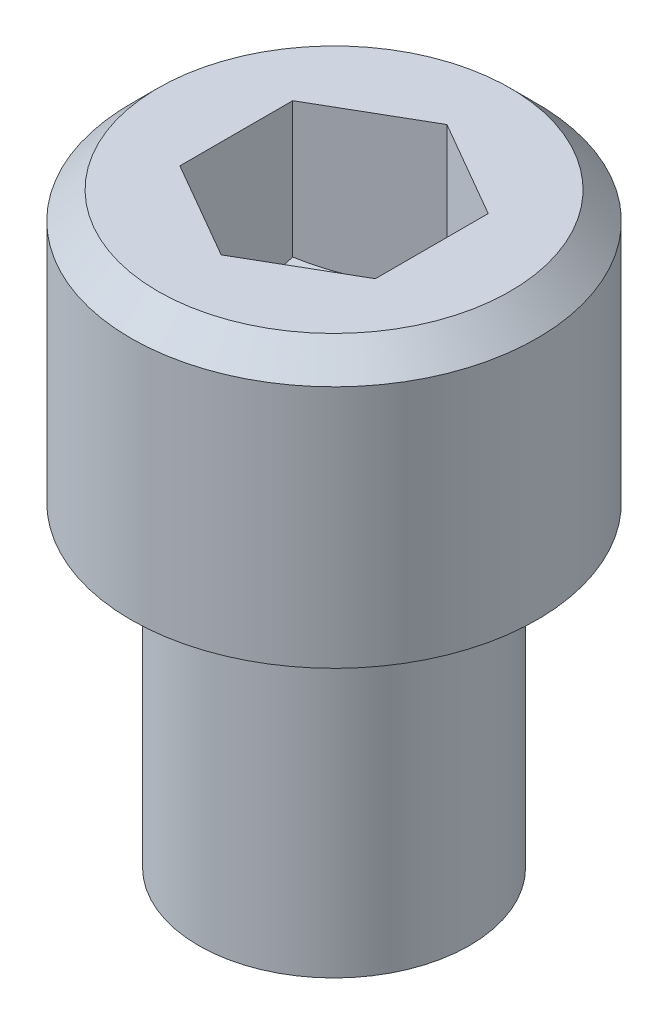
ISO-10303-21;
HEADER;
FILE_DESCRIPTION(('STEP AP214'),'2;1');
FILE_NAME('part.step','',(''),(''),'','','');
FILE_SCHEMA(('AUTOMOTIVE_DESIGN { 1 0 10303 214 1 1 1 1 }'));
ENDSEC;
DATA;
#1=APPLICATION_CONTEXT('core data for automotive mechanical design processes');
#2=APPLICATION_PROTOCOL_DEFINITION('international standard','automotive_design',2000,#1);
#3=PRODUCT_CONTEXT('',#1,'mechanical');
#4=PRODUCT('Part','Part','',(#3));
#5=PRODUCT_RELATED_PRODUCT_CATEGORY('part','',(#4));
#6=PRODUCT_DEFINITION_FORMATION('','',#4);
#7=PRODUCT_DEFINITION_CONTEXT('part definition',#1,'design');
#8=PRODUCT_DEFINITION('design','',#6,#7);
#9=PRODUCT_DEFINITION_SHAPE('','',#8);
#10=(LENGTH_UNIT() NAMED_UNIT(*) SI_UNIT(.MILLI.,.METRE.));
#11=(NAMED_UNIT(*) PLANE_ANGLE_UNIT() SI_UNIT($,.RADIAN.));
#12=(NAMED_UNIT(*) SI_UNIT($,.STERADIAN.) SOLID_ANGLE_UNIT());
#13=UNCERTAINTY_MEASURE_WITH_UNIT(LENGTH_MEASURE(1.E-05),#10,'distance_accuracy_value','');
#14=(GEOMETRIC_REPRESENTATION_CONTEXT(3) GLOBAL_UNCERTAINTY_ASSIGNED_CONTEXT((#13)) GLOBAL_UNIT_ASSIGNED_CONTEXT((#10,
#11,#12)) REPRESENTATION_CONTEXT('',''));
#15=CARTESIAN_POINT('',(0.,0.,0.));
#16=DIRECTION('',(0.,0.,1.));
#17=DIRECTION('',(1.,0.,0.));
#18=AXIS2_PLACEMENT_3D('',#15,#16,#17);
#19=CARTESIAN_POINT('',(0.,0.,0.));
#20=DIRECTION('',(0.,1.,0.));
#21=DIRECTION('',(0.,0.,1.));
#22=AXIS2_PLACEMENT_3D('',#19,#20,#21);
#23=PLANE('',#22);
#24=CARTESIAN_POINT('',(0.,0.,0.));
#25=DIRECTION('',(0.,1.,0.));
#26=DIRECTION('',(0.,0.,1.));
#27=AXIS2_PLACEMENT_3D('',#24,#25,#26);
#28=CIRCLE('',#27,9.);
#29=CARTESIAN_POINT('',(0.,0.,9.));
#30=VERTEX_POINT('',#29);
#31=EDGE_CURVE('E192',#30,#30,#28,.T.);
#32=ORIENTED_EDGE('',*,*,#31,.F.);
#33=EDGE_LOOP('',(#32));
#34=FACE_BOUND('',#33,.T.);
#35=CARTESIAN_POINT('',(0.,0.,0.));
#36=DIRECTION('',(0.,1.,0.));
#37=DIRECTION('',(0.,0.,1.));
#38=AXIS2_PLACEMENT_3D('',#35,#36,#37);
#39=CIRCLE('',#38,6.);
#40=CARTESIAN_POINT('',(0.,0.,6.));
#41=VERTEX_POINT('',#40);
#42=EDGE_CURVE('E11',#41,#41,#39,.F.);
#43=ORIENTED_EDGE('',*,*,#42,.F.);
#44=EDGE_LOOP('',(#43));
#45=FACE_BOUND('',#44,.T.);
#46=ADVANCED_FACE('F32',(#34,#45),#23,.F.);
#47=CARTESIAN_POINT('',(0.,12.,0.));
#48=DIRECTION('',(0.,1.,0.));
#49=DIRECTION('',(0.,0.,1.));
#50=AXIS2_PLACEMENT_3D('',#47,#48,#49);
#51=PLANE('',#50);
#52=CARTESIAN_POINT('',(0.,12.,0.));
#53=DIRECTION('',(0.,1.,0.));
#54=DIRECTION('',(0.,0.,1.));
#55=AXIS2_PLACEMENT_3D('',#52,#53,#54);
#56=CIRCLE('',#55,7.80000000000001);
#57=CARTESIAN_POINT('',(0.,12.,7.80000000000001));
#58=VERTEX_POINT('',#57);
#59=EDGE_CURVE('E105',#58,#58,#56,.T.);
#60=ORIENTED_EDGE('',*,*,#59,.T.);
#61=EDGE_LOOP('',(#60));
#62=FACE_BOUND('',#61,.T.);
#63=DIRECTION('',(-0.866025403784439,0.,0.5));
#64=VECTOR('',#63,1.);
#65=CARTESIAN_POINT('',(0.,12.,-5.));
#66=LINE('',#65,#64);
#67=CARTESIAN_POINT('',(0.,12.,-5.));
#68=VERTEX_POINT('',#67);
#69=CARTESIAN_POINT('',(-4.33012701892219,12.,-2.5));
#70=VERTEX_POINT('',#69);
#71=EDGE_CURVE('E168',#68,#70,#66,.T.);
#72=ORIENTED_EDGE('',*,*,#71,.F.);
#73=DIRECTION('',(-0.866025403784439,0.,-0.5));
#74=VECTOR('',#73,1.);
#75=CARTESIAN_POINT('',(4.33012701892219,12.,-2.5));
#76=LINE('',#75,#74);
#77=CARTESIAN_POINT('',(4.33012701892219,12.,-2.5));
#78=VERTEX_POINT('',#77);
#79=EDGE_CURVE('E166',#78,#68,#76,.T.);
#80=ORIENTED_EDGE('',*,*,#79,.F.);
#81=DIRECTION('',(0.,0.,-1.));
#82=VECTOR('',#81,1.);
#83=CARTESIAN_POINT('',(4.33012701892219,12.,2.5));
#84=LINE('',#83,#82);
#85=CARTESIAN_POINT('',(4.3301270189222,12.,2.5));
#86=VERTEX_POINT('',#85);
#87=EDGE_CURVE('E177',#86,#78,#84,.T.);
#88=ORIENTED_EDGE('',*,*,#87,.F.);
#89=DIRECTION('',(0.866025403784439,0.,-0.5));
#90=VECTOR('',#89,1.);
#91=CARTESIAN_POINT('',(0.,12.,5.));
#92=LINE('',#91,#90);
#93=CARTESIAN_POINT('',(0.,12.,5.));
#94=VERTEX_POINT('',#93);
#95=EDGE_CURVE('E174',#94,#86,#92,.T.);
#96=ORIENTED_EDGE('',*,*,#95,.F.);
#97=DIRECTION('',(0.866025403784439,0.,0.5));
#98=VECTOR('',#97,1.);
#99=CARTESIAN_POINT('',(-4.33012701892219,12.,2.5));
#100=LINE('',#99,#98);
#101=CARTESIAN_POINT('',(-4.33012701892219,12.,2.5));
#102=VERTEX_POINT('',#101);
#103=EDGE_CURVE('E172',#102,#94,#100,.T.);
#104=ORIENTED_EDGE('',*,*,#103,.F.);
#105=DIRECTION('',(0.,0.,1.));
#106=VECTOR('',#105,1.);
#107=CARTESIAN_POINT('',(-4.33012701892219,12.,-2.5));
#108=LINE('',#107,#106);
#109=EDGE_CURVE('E170',#70,#102,#108,.T.);
#110=ORIENTED_EDGE('',*,*,#109,.F.);
#111=EDGE_LOOP('',(#72,#80,#88,#96,#104,#110));
#112=FACE_BOUND('',#111,.T.);
#113=ADVANCED_FACE('F160',(#62,#112),#51,.T.);
#114=CARTESIAN_POINT('',(0.,12.,0.));
#115=DIRECTION('',(0.,-1.,0.));
#116=DIRECTION('',(0.,0.,-1.));
#117=AXIS2_PLACEMENT_3D('',#114,#115,#116);
#118=CYLINDRICAL_SURFACE('',#117,9.);
#119=CARTESIAN_POINT('',(0.,10.8,0.));
#120=DIRECTION('',(0.,1.,0.));
#121=DIRECTION('',(0.,0.,1.));
#122=AXIS2_PLACEMENT_3D('',#119,#120,#121);
#123=CIRCLE('',#122,9.);
#124=CARTESIAN_POINT('',(0.,10.8,9.));
#125=VERTEX_POINT('',#124);
#126=EDGE_CURVE('E103',#125,#125,#123,.F.);
#127=ORIENTED_EDGE('',*,*,#126,.T.);
#128=EDGE_LOOP('',(#127));
#129=FACE_BOUND('',#128,.T.);
#130=ORIENTED_EDGE('',*,*,#31,.T.);
#131=EDGE_LOOP('',(#130));
#132=FACE_BOUND('',#131,.T.);
#133=ADVANCED_FACE('F158',(#129,#132),#118,.T.);
#134=CARTESIAN_POINT('',(4.33012701892219,12.,-2.5));
#135=DIRECTION('',(-0.5,0.,0.866025403784439));
#136=DIRECTION('',(0.866025403784439,0.,0.5));
#137=AXIS2_PLACEMENT_3D('',#134,#135,#136);
#138=PLANE('',#137);
#139=CARTESIAN_POINT('',(4.33032701892219,6.00006666897601,-2.49988452994616));
#140=CARTESIAN_POINT('',(4.14004078544935,5.93661518738275,-2.60974633806479));
#141=CARTESIAN_POINT('',(3.94811201136026,5.8789085493871,-2.72055646745036));
#142=CARTESIAN_POINT('',(3.56093106971089,5.77818142651496,-2.94409548833672));
#143=CARTESIAN_POINT('',(3.36567202289597,5.73519657450752,-3.05682835157702));
#144=CARTESIAN_POINT('',(2.97757377809984,5.66828492722043,-3.28089697768209));
#145=CARTESIAN_POINT('',(2.78479429102455,5.64391279044533,-3.39219826643924));
#146=CARTESIAN_POINT('',(2.39832830222651,5.6148184467658,-3.61532450910442));
#147=CARTESIAN_POINT('',(2.20464320504323,5.61007214625764,-3.72714865210122));
#148=CARTESIAN_POINT('',(1.84273701779403,5.6199502727417,-3.93609528673093));
#149=CARTESIAN_POINT('',(1.67446173006313,5.63214928589842,-4.03324906940033));
#150=CARTESIAN_POINT('',(1.33900745806068,5.67081169934835,-4.22692368364175));
#151=CARTESIAN_POINT('',(1.17182963391279,5.69728830462509,-4.32344384541607));
#152=CARTESIAN_POINT('',(0.8356838141519,5.76347725907439,-4.51751772494199));
#153=CARTESIAN_POINT('',(0.666758359478567,5.80347015912964,-4.61504688167062));
#154=CARTESIAN_POINT('',(0.331426820726031,5.89423811947165,-4.80865063583716));
#155=CARTESIAN_POINT('',(0.165016441115957,5.9449918547392,-4.90472771330099));
#156=CARTESIAN_POINT('',(-0.000200000000000056,6.00006666897601,-5.00011547005384));
#157=B_SPLINE_CURVE_WITH_KNOTS('',3,(#139,#140,#141,#142,#143,#144,#145,#146,#147,#148,#149,
#150,#151,#152,#153,#154,#155,#156),.UNSPECIFIED.,.F.,.F.,(4,2,2,2,2,2,2,2,4),(0.,
0.686375611076472,1.37440098738211,2.04539832488976,2.71557166935567,3.29908680780407,
3.88314255256259,4.48015300784625,5.07599122973506),.UNSPECIFIED.);
#158=CARTESIAN_POINT('',(4.33012701892219,6.,-2.5));
#159=VERTEX_POINT('',#158);
#160=CARTESIAN_POINT('',(0.,6.,-5.));
#161=VERTEX_POINT('',#160);
#162=EDGE_CURVE('E98',#159,#161,#157,.T.);
#163=ORIENTED_EDGE('',*,*,#162,.F.);
#164=DIRECTION('',(0.,-1.,0.));
#165=VECTOR('',#164,1.);
#166=CARTESIAN_POINT('',(4.33012701892219,12.,-2.5));
#167=LINE('',#166,#165);
#168=EDGE_CURVE('E179',#78,#159,#167,.T.);
#169=ORIENTED_EDGE('',*,*,#168,.F.);
#170=ORIENTED_EDGE('',*,*,#79,.T.);
#171=DIRECTION('',(0.,-1.,0.));
#172=VECTOR('',#171,1.);
#173=CARTESIAN_POINT('',(0.,12.,-5.));
#174=LINE('',#173,#172);
#175=EDGE_CURVE('E190',#68,#161,#174,.T.);
#176=ORIENTED_EDGE('',*,*,#175,.T.);
#177=EDGE_LOOP('',(#163,#169,#170,#176));
#178=FACE_BOUND('',#177,.T.);
#179=ADVANCED_FACE('F154',(#178),#138,.T.);
#180=CARTESIAN_POINT('',(0.,12.,-5.));
#181=DIRECTION('',(0.5,0.,0.866025403784439));
#182=DIRECTION('',(0.866025403784439,0.,-0.5));
#183=AXIS2_PLACEMENT_3D('',#180,#181,#182);
#184=PLANE('',#183);
#185=CARTESIAN_POINT('',(0.000199999999999773,6.00006666897601,-5.00011547005384));
#186=CARTESIAN_POINT('',(-0.190086233472842,5.93661518738275,-4.89025366193521));
#187=CARTESIAN_POINT('',(-0.38201500756193,5.8789085493871,-4.77944353254964));
#188=CARTESIAN_POINT('',(-0.7691959492113,5.77818142651496,-4.55590451166329));
#189=CARTESIAN_POINT('',(-0.964454996026227,5.73519657450752,-4.44317164842298));
#190=CARTESIAN_POINT('',(-1.35255324082236,5.66828492722043,-4.21910302231791));
#191=CARTESIAN_POINT('',(-1.54533272789764,5.64391279044533,-4.10780173356076));
#192=CARTESIAN_POINT('',(-1.93179871669568,5.6148184467658,-3.88467549089558));
#193=CARTESIAN_POINT('',(-2.12548381387897,5.61007214625764,-3.77285134789879));
#194=CARTESIAN_POINT('',(-2.48739000112816,5.6199502727417,-3.56390471326907));
#195=CARTESIAN_POINT('',(-2.65566528885906,5.63214928589842,-3.46675093059968));
#196=CARTESIAN_POINT('',(-2.99111956086151,5.67081169934835,-3.27307631635825));
#197=CARTESIAN_POINT('',(-3.1582973850094,5.69728830462509,-3.17655615458393));
#198=CARTESIAN_POINT('',(-3.49444320477029,5.76347725907439,-2.98248227505801));
#199=CARTESIAN_POINT('',(-3.66336865944363,5.80347015912964,-2.88495311832939));
#200=CARTESIAN_POINT('',(-3.99870019819616,5.89423811947164,-2.69134936416284));
#201=CARTESIAN_POINT('',(-4.16511057780624,5.9449918547392,-2.59527228669901));
#202=CARTESIAN_POINT('',(-4.33032701892219,6.00006666897601,-2.49988452994616));
#203=B_SPLINE_CURVE_WITH_KNOTS('',3,(#185,#186,#187,#188,#189,#190,#191,#192,#193,#194,#195,
#196,#197,#198,#199,#200,#201,#202),.UNSPECIFIED.,.F.,.F.,(4,2,2,2,2,2,2,2,4),(0.,
0.686375611076471,1.37440098738211,2.04539832488976,2.71557166935567,3.29908680780407,
3.88314255256259,4.48015300784625,5.07599122973506),.UNSPECIFIED.);
#204=CARTESIAN_POINT('',(-4.33012701892219,6.,-2.5));
#205=VERTEX_POINT('',#204);
#206=EDGE_CURVE('E47',#161,#205,#203,.T.);
#207=ORIENTED_EDGE('',*,*,#206,.F.);
#208=ORIENTED_EDGE('',*,*,#175,.F.);
#209=ORIENTED_EDGE('',*,*,#71,.T.);
#210=DIRECTION('',(0.,-1.,0.));
#211=VECTOR('',#210,1.);
#212=CARTESIAN_POINT('',(-4.33012701892219,12.,-2.5));
#213=LINE('',#212,#211);
#214=EDGE_CURVE('E188',#70,#205,#213,.T.);
#215=ORIENTED_EDGE('',*,*,#214,.T.);
#216=EDGE_LOOP('',(#207,#208,#209,#215));
#217=FACE_BOUND('',#216,.T.);
#218=ADVANCED_FACE('F150',(#217),#184,.T.);
#219=CARTESIAN_POINT('',(-4.33012701892219,12.,-2.5));
#220=DIRECTION('',(1.,0.,0.));
#221=DIRECTION('',(0.,0.,-1.));
#222=AXIS2_PLACEMENT_3D('',#219,#220,#221);
#223=PLANE('',#222);
#224=CARTESIAN_POINT('',(-4.33012701892219,7.61009403147699,-6.4741682898585));
#225=CARTESIAN_POINT('',(-4.33012701892219,7.52038340118533,-6.28717848987909));
#226=CARTESIAN_POINT('',(-4.33012701892219,7.43160457722345,-6.09973315720104));
#227=CARTESIAN_POINT('',(-4.33012701892219,7.25643914300914,-5.72368864587061));
#228=CARTESIAN_POINT('',(-4.33012701892219,7.17005296319111,-5.5350892669621));
#229=CARTESIAN_POINT('',(-4.33012701892219,6.99971881397606,-5.15541249582157));
#230=CARTESIAN_POINT('',(-4.33012701892219,6.91578881358715,-4.96432701172369));
#231=CARTESIAN_POINT('',(-4.33012701892219,6.75169244134689,-4.58055257323054));
#232=CARTESIAN_POINT('',(-4.33012701892219,6.67152587392421,-4.38786370277116));
#233=CARTESIAN_POINT('',(-4.33012701892219,6.51391715910766,-3.99550021428121));
#234=CARTESIAN_POINT('',(-4.33012701892219,6.43660104526024,-3.79577467064629));
#235=CARTESIAN_POINT('',(-4.33012701892219,6.28839695121308,-3.39390776967773));
#236=CARTESIAN_POINT('',(-4.33012701892219,6.21750971601498,-3.19176613542294));
#237=CARTESIAN_POINT('',(-4.33012701892219,6.08418757472937,-2.7852033855588));
#238=CARTESIAN_POINT('',(-4.33012701892219,6.02173347871703,-2.58078863133344));
#239=CARTESIAN_POINT('',(-4.33012701892219,5.90742238006998,-2.16904754032952));
#240=CARTESIAN_POINT('',(-4.33012701892219,5.85556181578584,-1.96172220725353));
#241=CARTESIAN_POINT('',(-4.33012701892219,5.76519323818287,-1.54456503958764));
#242=CARTESIAN_POINT('',(-4.33012701892219,5.72665837796567,-1.33473913608323));
#243=CARTESIAN_POINT('',(-4.33012701892219,5.66546769672731,-0.912739827040648));
#244=CARTESIAN_POINT('',(-4.33012701892219,5.64281080264492,-0.700566581124674));
#245=CARTESIAN_POINT('',(-4.33012701892219,5.61547816998538,-0.277589543764856));
#246=CARTESIAN_POINT('',(-4.33012701892219,5.61059024163811,-0.0667998032509022));
#247=CARTESIAN_POINT('',(-4.33012701892219,5.61866439766529,0.354450188492367));
#248=CARTESIAN_POINT('',(-4.33012701892219,5.63162758731175,0.564910418511908));
#249=CARTESIAN_POINT('',(-4.33012701892219,5.66865754341403,0.929344997469507));
#250=CARTESIAN_POINT('',(-4.33012701892219,5.68894214035009,1.08372220201376));
#251=CARTESIAN_POINT('',(-4.33012701892219,5.73772050892576,1.39118359853181));
#252=CARTESIAN_POINT('',(-4.33012701892219,5.76621559888912,1.54426757879181));
#253=CARTESIAN_POINT('',(-4.33012701892219,5.8625007158806,2.00146114737109));
#254=CARTESIAN_POINT('',(-4.33012701892219,5.94106835559255,2.30331757623056));
#255=CARTESIAN_POINT('',(-4.33012701892219,6.0752851269398,2.75464715166709));
#256=CARTESIAN_POINT('',(-4.33012701892219,6.12337097880731,2.90649985253635));
#257=CARTESIAN_POINT('',(-4.33012701892219,6.22401999217874,3.20872849131109));
#258=CARTESIAN_POINT('',(-4.33012701892219,6.27658318582277,3.35910441860707));
#259=CARTESIAN_POINT('',(-4.33012701892219,6.38538676021353,3.65843961566313));
#260=CARTESIAN_POINT('',(-4.33012701892219,6.4416256545281,3.80739943051664));
#261=CARTESIAN_POINT('',(-4.33012701892219,6.55717098070335,4.10411840932818));
#262=CARTESIAN_POINT('',(-4.33012701892219,6.61647736196836,4.25187759304315));
#263=CARTESIAN_POINT('',(-4.33012701892219,6.77166513761405,4.62905118926531));
#264=CARTESIAN_POINT('',(-4.33012701892219,6.86937861501647,4.85771081595634));
#265=CARTESIAN_POINT('',(-4.33012701892219,7.06950595728482,5.31297018063553));
#266=CARTESIAN_POINT('',(-4.33012701892219,7.17192017307744,5.53956976331632));
#267=CARTESIAN_POINT('',(-4.33012701892219,7.38038981958542,5.99114879939238));
#268=CARTESIAN_POINT('',(-4.33012701892219,7.48644611501208,6.21612785248354));
#269=CARTESIAN_POINT('',(-4.33012701892219,7.70138647019085,6.66473352575846));
#270=CARTESIAN_POINT('',(-4.33012701892219,7.81027059283695,6.88836011572534));
#271=CARTESIAN_POINT('',(-4.33012701892219,8.03040773631116,7.33476999454761));
#272=CARTESIAN_POINT('',(-4.33012701892219,8.14166339730193,7.55755197921888));
#273=CARTESIAN_POINT('',(-4.33012701892219,8.36598226207261,8.00220490390719));
#274=CARTESIAN_POINT('',(-4.33012701892219,8.47904548071929,8.22407583641213));
#275=CARTESIAN_POINT('',(-4.33012701892219,8.82038665147864,8.88849559453198));
#276=CARTESIAN_POINT('',(-4.33012701892219,9.05085072234566,9.32992097620988));
#277=CARTESIAN_POINT('',(-4.33012701892219,9.49381242040252,10.1691035571181));
#278=CARTESIAN_POINT('',(-4.33012701892219,9.7059528349729,10.567050114055));
#279=CARTESIAN_POINT('',(-4.33012701892219,10.1326535381327,11.3616648413254));
#280=CARTESIAN_POINT('',(-4.33012701892219,10.3472139293483,11.7583329565186));
#281=CARTESIAN_POINT('',(-4.33012701892219,10.7775972555593,12.5496753740671));
#282=CARTESIAN_POINT('',(-4.33012701892219,10.993415591119,12.944352181483));
#283=CARTESIAN_POINT('',(-4.33012701892219,11.426455764524,13.7329057206726));
#284=CARTESIAN_POINT('',(-4.33012701892219,11.643677520619,14.1267824973231));
#285=CARTESIAN_POINT('',(-4.33012701892219,11.8614145371266,14.5203725487116));
#286=B_SPLINE_CURVE_WITH_KNOTS('',3,(#224,#225,#226,#227,#228,#229,#230,#231,#232,#233,#234,
#235,#236,#237,#238,#239,#240,#241,#242,#243,#244,#245,#246,#247,#248,#249,#250,#251,#252,#253,
#254,#255,#256,#257,#258,#259,#260,#261,#262,#263,#264,#265,#266,#267,#268,#269,#270,#271,#272,
#273,#274,#275,#276,#277,#278,#279,#280,#281,#282,#283,#284,#285),.UNSPECIFIED.,.F.,.F.,(4,2,2,
2,2,2,2,2,2,2,2,2,2,2,2,2,2,2,2,2,2,2,2,2,2,2,2,2,2,2,4),(0.,0.622197434842259,1.24450608480009,
1.87058968170862,2.49664070733074,3.13906027546401,3.78155419462066,4.422560528123,
5.0633509929915,5.70284285065105,6.34229148614306,6.97407852760912,7.60590468863822,
8.07278637350441,8.53974306538027,9.47424200688512,9.95206125928538,10.4298839419475,
10.907514577335,11.3851373371092,12.1310492237517,12.8770168862035,13.623162899494,
14.3693255221282,15.1163673706711,15.8634153666383,17.3572782089011,18.7101498425484,
20.0630790660007,21.4125670678381,22.7619771571781),.UNSPECIFIED.);
#287=CARTESIAN_POINT('',(-4.33012701892219,6.,2.5));
#288=VERTEX_POINT('',#287);
#289=EDGE_CURVE('E55',#205,#288,#286,.T.);
#290=ORIENTED_EDGE('',*,*,#289,.F.);
#291=ORIENTED_EDGE('',*,*,#214,.F.);
#292=ORIENTED_EDGE('',*,*,#109,.T.);
#293=DIRECTION('',(0.,-1.,0.));
#294=VECTOR('',#293,1.);
#295=CARTESIAN_POINT('',(-4.33012701892219,12.,2.5));
#296=LINE('',#295,#294);
#297=EDGE_CURVE('E186',#102,#288,#296,.T.);
#298=ORIENTED_EDGE('',*,*,#297,.T.);
#299=EDGE_LOOP('',(#290,#291,#292,#298));
#300=FACE_BOUND('',#299,.T.);
#301=ADVANCED_FACE('F147',(#300),#223,.T.);
#302=CARTESIAN_POINT('',(-4.33012701892219,12.,2.5));
#303=DIRECTION('',(0.5,0.,-0.866025403784439));
#304=DIRECTION('',(-0.866025403784439,0.,-0.5));
#305=AXIS2_PLACEMENT_3D('',#302,#303,#304);
#306=PLANE('',#305);
#307=CARTESIAN_POINT('',(-4.33032701892219,6.00006666897601,2.49988452994616));
#308=CARTESIAN_POINT('',(-4.14004078544935,5.93661518738275,2.60974633806479));
#309=CARTESIAN_POINT('',(-3.94811201136026,5.8789085493871,2.72055646745036));
#310=CARTESIAN_POINT('',(-3.56093106971089,5.77818142651496,2.94409548833671));
#311=CARTESIAN_POINT('',(-3.36567202289597,5.73519657450752,3.05682835157702));
#312=CARTESIAN_POINT('',(-2.97757377809984,5.66828492722043,3.28089697768209));
#313=CARTESIAN_POINT('',(-2.78479429102455,5.64391279044533,3.39219826643924));
#314=CARTESIAN_POINT('',(-2.39832830222651,5.6148184467658,3.61532450910442));
#315=CARTESIAN_POINT('',(-2.20464320504322,5.61007214625764,3.72714865210121));
#316=CARTESIAN_POINT('',(-1.84273701779403,5.6199502727417,3.93609528673093));
#317=CARTESIAN_POINT('',(-1.67446173006313,5.63214928589842,4.03324906940032));
#318=CARTESIAN_POINT('',(-1.33900745806068,5.67081169934835,4.22692368364175));
#319=CARTESIAN_POINT('',(-1.17182963391279,5.69728830462509,4.32344384541607));
#320=CARTESIAN_POINT('',(-0.8356838141519,5.76347725907439,4.51751772494199));
#321=CARTESIAN_POINT('',(-0.666758359478567,5.80347015912963,4.61504688167062));
#322=CARTESIAN_POINT('',(-0.331426820726032,5.89423811947164,4.80865063583716));
#323=CARTESIAN_POINT('',(-0.165016441115957,5.9449918547392,4.90472771330099));
#324=CARTESIAN_POINT('',(0.000199999999999417,6.00006666897601,5.00011547005384));
#325=B_SPLINE_CURVE_WITH_KNOTS('',3,(#307,#308,#309,#310,#311,#312,#313,#314,#315,#316,#317,
#318,#319,#320,#321,#322,#323,#324),.UNSPECIFIED.,.F.,.F.,(4,2,2,2,2,2,2,2,4),(0.,
0.686375611076472,1.37440098738212,2.04539832488976,2.71557166935567,3.29908680780407,
3.88314255256259,4.48015300784625,5.07599122973506),.UNSPECIFIED.);
#326=CARTESIAN_POINT('',(0.,6.,5.));
#327=VERTEX_POINT('',#326);
#328=EDGE_CURVE('E132',#288,#327,#325,.T.);
#329=ORIENTED_EDGE('',*,*,#328,.F.);
#330=ORIENTED_EDGE('',*,*,#297,.F.);
#331=ORIENTED_EDGE('',*,*,#103,.T.);
#332=DIRECTION('',(0.,-1.,0.));
#333=VECTOR('',#332,1.);
#334=CARTESIAN_POINT('',(0.,12.,5.));
#335=LINE('',#334,#333);
#336=EDGE_CURVE('E183',#94,#327,#335,.T.);
#337=ORIENTED_EDGE('',*,*,#336,.T.);
#338=EDGE_LOOP('',(#329,#330,#331,#337));
#339=FACE_BOUND('',#338,.T.);
#340=ADVANCED_FACE('F122',(#339),#306,.T.);
#341=CARTESIAN_POINT('',(0.,12.,5.));
#342=DIRECTION('',(-0.5,0.,-0.866025403784439));
#343=DIRECTION('',(-0.866025403784439,0.,0.5));
#344=AXIS2_PLACEMENT_3D('',#341,#342,#343);
#345=PLANE('',#344);
#346=CARTESIAN_POINT('',(-0.000200000000000042,6.00006666897601,5.00011547005384));
#347=CARTESIAN_POINT('',(0.190086233472842,5.93661518738275,4.89025366193521));
#348=CARTESIAN_POINT('',(0.38201500756193,5.8789085493871,4.77944353254964));
#349=CARTESIAN_POINT('',(0.7691959492113,5.77818142651496,4.55590451166329));
#350=CARTESIAN_POINT('',(0.964454996026226,5.73519657450752,4.44317164842298));
#351=CARTESIAN_POINT('',(1.35255324082236,5.66828492722043,4.21910302231791));
#352=CARTESIAN_POINT('',(1.54533272789764,5.64391279044533,4.10780173356076));
#353=CARTESIAN_POINT('',(1.93179871669568,5.6148184467658,3.88467549089558));
#354=CARTESIAN_POINT('',(2.12548381387897,5.61007214625764,3.77285134789879));
#355=CARTESIAN_POINT('',(2.48739000112816,5.6199502727417,3.56390471326907));
#356=CARTESIAN_POINT('',(2.65566528885906,5.63214928589842,3.46675093059968));
#357=CARTESIAN_POINT('',(2.99111956086151,5.67081169934835,3.27307631635825));
#358=CARTESIAN_POINT('',(3.1582973850094,5.69728830462509,3.17655615458393));
#359=CARTESIAN_POINT('',(3.49444320477029,5.76347725907439,2.98248227505801));
#360=CARTESIAN_POINT('',(3.66336865944363,5.80347015912964,2.88495311832938));
#361=CARTESIAN_POINT('',(3.99870019819616,5.89423811947165,2.69134936416284));
#362=CARTESIAN_POINT('',(4.16511057780624,5.9449918547392,2.59527228669901));
#363=CARTESIAN_POINT('',(4.33032701892219,6.00006666897602,2.49988452994616));
#364=B_SPLINE_CURVE_WITH_KNOTS('',3,(#346,#347,#348,#349,#350,#351,#352,#353,#354,#355,#356,
#357,#358,#359,#360,#361,#362,#363),.UNSPECIFIED.,.F.,.F.,(4,2,2,2,2,2,2,2,4),(0.,
0.686375611076471,1.37440098738211,2.04539832488976,2.71557166935567,3.29908680780407,
3.88314255256259,4.48015300784625,5.07599122973506),.UNSPECIFIED.);
#365=CARTESIAN_POINT('',(4.33012701892219,6.,2.5));
#366=VERTEX_POINT('',#365);
#367=EDGE_CURVE('E100',#327,#366,#364,.T.);
#368=ORIENTED_EDGE('',*,*,#367,.F.);
#369=ORIENTED_EDGE('',*,*,#336,.F.);
#370=ORIENTED_EDGE('',*,*,#95,.T.);
#371=DIRECTION('',(0.,-1.,0.));
#372=VECTOR('',#371,1.);
#373=CARTESIAN_POINT('',(4.33012701892219,12.,2.5));
#374=LINE('',#373,#372);
#375=EDGE_CURVE('E181',#86,#366,#374,.T.);
#376=ORIENTED_EDGE('',*,*,#375,.T.);
#377=EDGE_LOOP('',(#368,#369,#370,#376));
#378=FACE_BOUND('',#377,.T.);
#379=ADVANCED_FACE('F118',(#378),#345,.T.);
#380=CARTESIAN_POINT('',(4.33012701892219,12.,2.5));
#381=DIRECTION('',(-1.,0.,0.));
#382=DIRECTION('',(0.,0.,1.));
#383=AXIS2_PLACEMENT_3D('',#380,#381,#382);
#384=PLANE('',#383);
#385=CARTESIAN_POINT('',(4.33012701892219,7.6100940303595,-6.47416828752991));
#386=CARTESIAN_POINT('',(4.33012701892219,7.52038340011598,-6.28717848763009));
#387=CARTESIAN_POINT('',(4.33012701892219,7.43160457620221,-6.09973315503168));
#388=CARTESIAN_POINT('',(4.33012701892219,7.25643914208385,-5.72368864386082));
#389=CARTESIAN_POINT('',(4.33012701892219,7.17005296231366,-5.53508926503224));
#390=CARTESIAN_POINT('',(4.33012701892219,6.99971881319436,-5.15541249405309));
#391=CARTESIAN_POINT('',(4.33012701892219,6.91578881285335,-4.96432701003666));
#392=CARTESIAN_POINT('',(4.33012701892219,6.75169244070795,-4.58055257170707));
#393=CARTESIAN_POINT('',(4.33012701892219,6.67152587333222,-4.38786370132978));
#394=CARTESIAN_POINT('',(4.33012701892219,6.51391715860989,-3.9955002130088));
#395=CARTESIAN_POINT('',(4.33012701892219,6.43660104480965,-3.7957746694608));
#396=CARTESIAN_POINT('',(4.33012701892219,6.28839695085397,-3.39390776866762));
#397=CARTESIAN_POINT('',(4.33012701892219,6.21750971570016,-3.19176613450129));
#398=CARTESIAN_POINT('',(4.33012701892219,6.08418757449827,-2.78520338481575));
#399=CARTESIAN_POINT('',(4.33012701892219,6.02173347852536,-2.5807886306805));
#400=CARTESIAN_POINT('',(4.33012701892219,5.90742237994983,-2.16904753985937));
#401=CARTESIAN_POINT('',(4.33012701892219,5.85556181569778,-1.96172220687604));
#402=CARTESIAN_POINT('',(4.33012701892219,5.76519323815374,-1.54456503942426));
#403=CARTESIAN_POINT('',(4.33012701892219,5.72665837796174,-1.33473913604166));
#404=CARTESIAN_POINT('',(4.33012701892219,5.66546769675489,-0.912739827245257));
#405=CARTESIAN_POINT('',(4.33012701892219,5.64281080267881,-0.700566581453644));
#406=CARTESIAN_POINT('',(4.33012701892219,5.61547817001009,-0.277589544340235));
#407=CARTESIAN_POINT('',(4.33012701892219,5.61059024164768,-0.0667998039483171));
#408=CARTESIAN_POINT('',(4.33012701892219,5.61866439762435,0.354450187553164));
#409=CARTESIAN_POINT('',(4.33012701892219,5.63162758723544,0.564910417452954));
#410=CARTESIAN_POINT('',(4.33012701892219,5.66865754326736,0.929344996254421));
#411=CARTESIAN_POINT('',(4.33012701892219,5.68894214017486,1.08372220076101));
#412=CARTESIAN_POINT('',(4.33012701892219,5.73772050869181,1.39118359720523));
#413=CARTESIAN_POINT('',(4.33012701892219,5.766215598625,1.54426757742906));
#414=CARTESIAN_POINT('',(4.33012701892219,5.86250071552524,2.00146114590156));
#415=CARTESIAN_POINT('',(4.33012701892219,5.94106835517542,2.30331757469223));
#416=CARTESIAN_POINT('',(4.33012701892219,6.07528512643108,2.75464715002565));
#417=CARTESIAN_POINT('',(4.33012701892219,6.1233709782678,2.90649985085987));
#418=CARTESIAN_POINT('',(4.33012701892219,6.22401999157841,3.20872848956484));
#419=CARTESIAN_POINT('',(4.33012701892219,6.27658318519241,3.35910441682609));
#420=CARTESIAN_POINT('',(4.33012701892219,6.385386759524,3.65843961381287));
#421=CARTESIAN_POINT('',(4.33012701892219,6.44162565380943,3.80739942863184));
#422=CARTESIAN_POINT('',(4.33012701892219,6.55717097992721,4.10411840737429));
#423=CARTESIAN_POINT('',(4.33012701892219,6.6164773611639,4.2518775910547));
#424=CARTESIAN_POINT('',(4.33012701892219,6.77166513676504,4.62905118725394));
#425=CARTESIAN_POINT('',(4.3301270189222,6.86937861415354,4.85771081395582));
#426=CARTESIAN_POINT('',(4.3301270189222,7.06950595639792,5.31297017865537));
#427=CARTESIAN_POINT('',(4.3301270189222,7.17192017218048,5.53956976134566));
#428=CARTESIAN_POINT('',(4.3301270189222,7.38038981867119,5.99114879743972));
#429=CARTESIAN_POINT('',(4.3301270189222,7.48644611409064,6.21612785053938));
#430=CARTESIAN_POINT('',(4.3301270189222,7.70138646925703,6.66473352383046));
#431=CARTESIAN_POINT('',(4.3301270189222,7.81027059189797,6.88836011380498));
#432=CARTESIAN_POINT('',(4.3301270189222,8.03040773536355,7.33476999264223));
#433=CARTESIAN_POINT('',(4.3301270189222,8.14166339635086,7.55755197732082));
#434=CARTESIAN_POINT('',(4.3301270189222,8.36598226111576,8.00220490202324));
#435=CARTESIAN_POINT('',(4.3301270189222,8.47904547976013,8.22407583453497));
#436=CARTESIAN_POINT('',(4.3301270189222,8.82038665051383,8.88849559267446));
#437=CARTESIAN_POINT('',(4.3301270189222,9.0508507213788,9.32992097436458));
#438=CARTESIAN_POINT('',(4.3301270189222,9.49381241942789,10.1691035552839));
#439=CARTESIAN_POINT('',(4.3301270189222,9.70595283399227,10.5670501122199));
#440=CARTESIAN_POINT('',(4.3301270189222,10.1326535371411,11.3616648394878));
#441=CARTESIAN_POINT('',(4.3301270189222,10.3472139283518,11.7583329546796));
#442=CARTESIAN_POINT('',(4.3301270189222,10.7775972545529,12.5496753722234));
#443=CARTESIAN_POINT('',(4.3301270189222,10.9934155901076,12.9443521796361));
#444=CARTESIAN_POINT('',(4.3301270189222,11.4264557635033,13.732905718819));
#445=CARTESIAN_POINT('',(4.3301270189222,11.6436775195938,14.1267824954659));
#446=CARTESIAN_POINT('',(4.3301270189222,11.8614145360971,14.5203725468509));
#447=B_SPLINE_CURVE_WITH_KNOTS('',3,(#385,#386,#387,#388,#389,#390,#391,#392,#393,#394,#395,
#396,#397,#398,#399,#400,#401,#402,#403,#404,#405,#406,#407,#408,#409,#410,#411,#412,#413,#414,
#415,#416,#417,#418,#419,#420,#421,#422,#423,#424,#425,#426,#427,#428,#429,#430,#431,#432,#433,
#434,#435,#436,#437,#438,#439,#440,#441,#442,#443,#444,#445,#446),.UNSPECIFIED.,.F.,.F.,(4,2,2,
2,2,2,2,2,2,2,2,2,2,2,2,2,2,2,2,2,2,2,2,2,2,2,2,2,2,2,4),(0.,0.622197434564538,1.2445060842446,
1.8705896808716,2.49664070621222,3.13906027405126,3.78155419291358,4.42256052612297,
5.06335099069879,5.70284284798614,6.34229148310644,6.97407852420889,7.60590468487407,
8.07278636961709,8.53974306136975,9.47424200262788,9.95206125490002,10.429883937434,
10.9075145726936,11.38513733234,12.1310492189959,12.8770168814612,13.6231628947654,
14.3693255174136,15.1163673659714,15.8634153619536,17.357278204246,18.7101498378824,
20.0630790613237,21.4125670631456,22.7619771524699),.UNSPECIFIED.);
#448=EDGE_CURVE('E40',#366,#159,#447,.F.);
#449=ORIENTED_EDGE('',*,*,#448,.F.);
#450=ORIENTED_EDGE('',*,*,#375,.F.);
#451=ORIENTED_EDGE('',*,*,#87,.T.);
#452=ORIENTED_EDGE('',*,*,#168,.T.);
#453=EDGE_LOOP('',(#449,#450,#451,#452));
#454=FACE_BOUND('',#453,.T.);
#455=ADVANCED_FACE('F114',(#454),#384,.T.);
#456=CARTESIAN_POINT('',(0.,12.,0.));
#457=DIRECTION('',(0.,-1.,0.));
#458=DIRECTION('',(0.,0.,-1.));
#459=AXIS2_PLACEMENT_3D('',#456,#457,#458);
#460=CONICAL_SURFACE('',#459,7.80000000000001,0.785398163397448);
#461=ORIENTED_EDGE('',*,*,#126,.F.);
#462=EDGE_LOOP('',(#461));
#463=FACE_BOUND('',#462,.T.);
#464=ORIENTED_EDGE('',*,*,#59,.F.);
#465=EDGE_LOOP('',(#464));
#466=FACE_BOUND('',#465,.T.);
#467=ADVANCED_FACE('F34',(#463,#466),#460,.T.);
#468=CARTESIAN_POINT('',(0.,6.,0.));
#469=DIRECTION('',(0.,1.,0.));
#470=DIRECTION('',(-1.,0.,0.));
#471=AXIS2_PLACEMENT_3D('',#468,#469,#470);
#472=CONICAL_SURFACE('',#471,5.,1.0471975511966);
#473=CARTESIAN_POINT('',(0.,3.11324865405189,0.));
#474=VERTEX_POINT('',#473);
#475=VERTEX_LOOP('',#474);
#476=FACE_BOUND('',#475,.T.);
#477=ORIENTED_EDGE('',*,*,#448,.T.);
#478=ORIENTED_EDGE('',*,*,#162,.T.);
#479=ORIENTED_EDGE('',*,*,#206,.T.);
#480=ORIENTED_EDGE('',*,*,#289,.T.);
#481=ORIENTED_EDGE('',*,*,#328,.T.);
#482=ORIENTED_EDGE('',*,*,#367,.T.);
#483=EDGE_LOOP('',(#477,#478,#479,#480,#481,#482));
#484=FACE_BOUND('',#483,.T.);
#485=ADVANCED_FACE('F89',(#476,#484),#472,.F.);
#486=CARTESIAN_POINT('',(0.,-14.,0.));
#487=DIRECTION('',(0.,1.,0.));
#488=DIRECTION('',(0.,0.,1.));
#489=AXIS2_PLACEMENT_3D('',#486,#487,#488);
#490=CYLINDRICAL_SURFACE('',#489,6.);
#491=CARTESIAN_POINT('',(0.,-14.,0.));
#492=DIRECTION('',(0.,-1.,0.));
#493=DIRECTION('',(0.,0.,-1.));
#494=AXIS2_PLACEMENT_3D('',#491,#492,#493);
#495=CIRCLE('',#494,6.);
#496=CARTESIAN_POINT('',(0.,-14.,-6.));
#497=VERTEX_POINT('',#496);
#498=EDGE_CURVE('E133',#497,#497,#495,.T.);
#499=ORIENTED_EDGE('',*,*,#498,.F.);
#500=EDGE_LOOP('',(#499));
#501=FACE_BOUND('',#500,.T.);
#502=ORIENTED_EDGE('',*,*,#42,.T.);
#503=EDGE_LOOP('',(#502));
#504=FACE_BOUND('',#503,.T.);
#505=ADVANCED_FACE('F92',(#501,#504),#490,.T.);
#506=CARTESIAN_POINT('',(0.,-14.,0.));
#507=DIRECTION('',(0.,-1.,0.));
#508=DIRECTION('',(0.,0.,-1.));
#509=AXIS2_PLACEMENT_3D('',#506,#507,#508);
#510=PLANE('',#509);
#511=ORIENTED_EDGE('',*,*,#498,.T.);
#512=EDGE_LOOP('',(#511));
#513=FACE_BOUND('',#512,.T.);
#514=ADVANCED_FACE('F265',(#513),#510,.T.);
#515=CLOSED_SHELL('',(#46,#113,#133,#179,#218,#301,#340,#379,#455,#467,#485,#505,#514));
#516=MANIFOLD_SOLID_BREP('B2',#515);
#517=ADVANCED_BREP_SHAPE_REPRESENTATION('',(#18,#516),#14);
#518=SHAPE_DEFINITION_REPRESENTATION(#9,#517);
ENDSEC;
END-ISO-10303-21;
